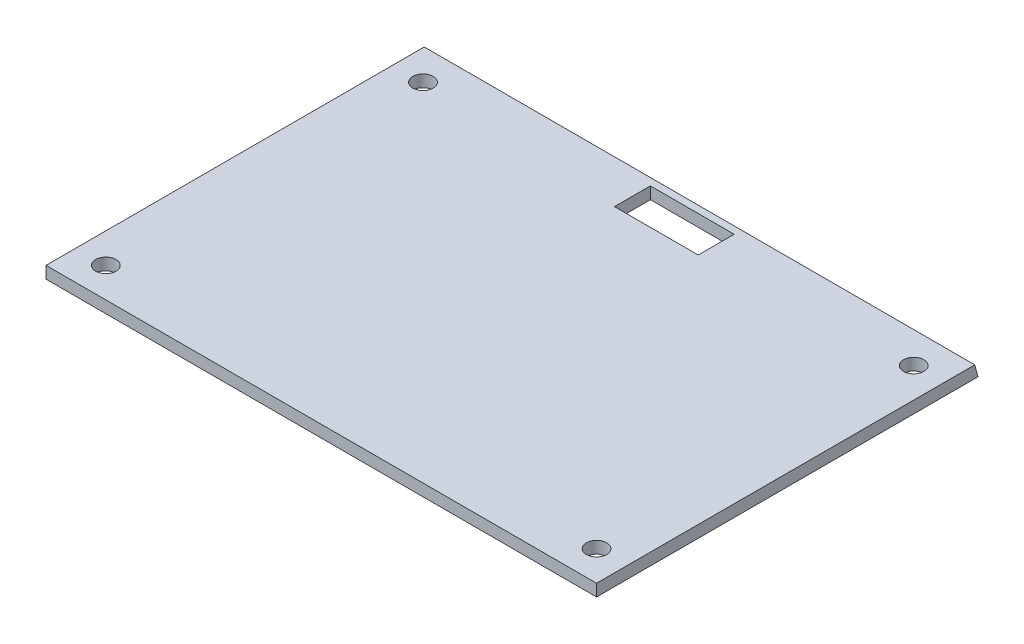
ISO-10303-21;
HEADER;
FILE_DESCRIPTION(('STEP AP214'),'2;1');
FILE_NAME('part.step','',(''),(''),'','','');
FILE_SCHEMA(('AUTOMOTIVE_DESIGN { 1 0 10303 214 1 1 1 1 }'));
ENDSEC;
DATA;
#1=APPLICATION_CONTEXT('core data for automotive mechanical design processes');
#2=APPLICATION_PROTOCOL_DEFINITION('international standard','automotive_design',2000,#1);
#3=PRODUCT_CONTEXT('',#1,'mechanical');
#4=PRODUCT('Part','Part','',(#3));
#5=PRODUCT_RELATED_PRODUCT_CATEGORY('part','',(#4));
#6=PRODUCT_DEFINITION_FORMATION('','',#4);
#7=PRODUCT_DEFINITION_CONTEXT('part definition',#1,'design');
#8=PRODUCT_DEFINITION('design','',#6,#7);
#9=PRODUCT_DEFINITION_SHAPE('','',#8);
#10=(LENGTH_UNIT() NAMED_UNIT(*) SI_UNIT(.MILLI.,.METRE.));
#11=(NAMED_UNIT(*) PLANE_ANGLE_UNIT() SI_UNIT($,.RADIAN.));
#12=(NAMED_UNIT(*) SI_UNIT($,.STERADIAN.) SOLID_ANGLE_UNIT());
#13=UNCERTAINTY_MEASURE_WITH_UNIT(LENGTH_MEASURE(1.E-05),#10,'distance_accuracy_value','');
#14=(GEOMETRIC_REPRESENTATION_CONTEXT(3) GLOBAL_UNCERTAINTY_ASSIGNED_CONTEXT((#13)) GLOBAL_UNIT_ASSIGNED_CONTEXT((#10,
#11,#12)) REPRESENTATION_CONTEXT('',''));
#15=CARTESIAN_POINT('',(0.,0.,0.));
#16=DIRECTION('',(0.,0.,1.));
#17=DIRECTION('',(1.,0.,0.));
#18=AXIS2_PLACEMENT_3D('',#15,#16,#17);
#19=CARTESIAN_POINT('',(-46.,-46.,120.));
#20=DIRECTION('',(0.,1.,0.));
#21=DIRECTION('',(0.,0.,1.));
#22=AXIS2_PLACEMENT_3D('',#19,#20,#21);
#23=PLANE('',#22);
#24=CARTESIAN_POINT('',(41.,-46.,62.));
#25=DIRECTION('',(0.,1.,0.));
#26=DIRECTION('',(0.,0.,1.));
#27=AXIS2_PLACEMENT_3D('',#24,#25,#26);
#28=CIRCLE('',#27,1.7);
#29=CARTESIAN_POINT('',(41.,-46.,63.7));
#30=VERTEX_POINT('',#29);
#31=EDGE_CURVE('E158',#30,#30,#28,.F.);
#32=ORIENTED_EDGE('',*,*,#31,.F.);
#33=EDGE_LOOP('',(#32));
#34=FACE_BOUND('',#33,.T.);
#35=CARTESIAN_POINT('',(-41.,-46.,115.));
#36=DIRECTION('',(0.,1.,0.));
#37=DIRECTION('',(0.,0.,1.));
#38=AXIS2_PLACEMENT_3D('',#35,#36,#37);
#39=CIRCLE('',#38,1.7);
#40=CARTESIAN_POINT('',(-41.,-46.,116.7));
#41=VERTEX_POINT('',#40);
#42=EDGE_CURVE('E147',#41,#41,#39,.F.);
#43=ORIENTED_EDGE('',*,*,#42,.F.);
#44=EDGE_LOOP('',(#43));
#45=FACE_BOUND('',#44,.T.);
#46=CARTESIAN_POINT('',(41.,-46.,115.));
#47=DIRECTION('',(0.,1.,0.));
#48=DIRECTION('',(0.,0.,1.));
#49=AXIS2_PLACEMENT_3D('',#46,#47,#48);
#50=CIRCLE('',#49,1.7);
#51=CARTESIAN_POINT('',(41.,-46.,116.7));
#52=VERTEX_POINT('',#51);
#53=EDGE_CURVE('E144',#52,#52,#50,.F.);
#54=ORIENTED_EDGE('',*,*,#53,.F.);
#55=EDGE_LOOP('',(#54));
#56=FACE_BOUND('',#55,.T.);
#57=CARTESIAN_POINT('',(-41.,-46.,62.));
#58=DIRECTION('',(0.,1.,0.));
#59=DIRECTION('',(0.,0.,1.));
#60=AXIS2_PLACEMENT_3D('',#57,#58,#59);
#61=CIRCLE('',#60,1.7);
#62=CARTESIAN_POINT('',(-41.,-46.,63.7));
#63=VERTEX_POINT('',#62);
#64=EDGE_CURVE('E141',#63,#63,#61,.F.);
#65=ORIENTED_EDGE('',*,*,#64,.F.);
#66=EDGE_LOOP('',(#65));
#67=FACE_BOUND('',#66,.T.);
#68=DIRECTION('',(0.,0.,-1.));
#69=VECTOR('',#68,1.);
#70=CARTESIAN_POINT('',(-7.,-46.,120.));
#71=LINE('',#70,#69);
#72=CARTESIAN_POINT('',(-7.,-46.,64.));
#73=VERTEX_POINT('',#72);
#74=CARTESIAN_POINT('',(-7.,-46.,58.));
#75=VERTEX_POINT('',#74);
#76=EDGE_CURVE('E179',#73,#75,#71,.T.);
#77=ORIENTED_EDGE('',*,*,#76,.F.);
#78=DIRECTION('',(-1.,0.,0.));
#79=VECTOR('',#78,1.);
#80=CARTESIAN_POINT('',(-46.,-46.,64.));
#81=LINE('',#80,#79);
#82=CARTESIAN_POINT('',(7.,-46.,64.));
#83=VERTEX_POINT('',#82);
#84=EDGE_CURVE('E177',#83,#73,#81,.T.);
#85=ORIENTED_EDGE('',*,*,#84,.F.);
#86=DIRECTION('',(0.,0.,1.));
#87=VECTOR('',#86,1.);
#88=CARTESIAN_POINT('',(7.,-46.,120.));
#89=LINE('',#88,#87);
#90=CARTESIAN_POINT('',(7.,-46.,58.));
#91=VERTEX_POINT('',#90);
#92=EDGE_CURVE('E175',#91,#83,#89,.T.);
#93=ORIENTED_EDGE('',*,*,#92,.F.);
#94=DIRECTION('',(1.,0.,0.));
#95=VECTOR('',#94,1.);
#96=CARTESIAN_POINT('',(-46.,-46.,58.));
#97=LINE('',#96,#95);
#98=EDGE_CURVE('E173',#75,#91,#97,.T.);
#99=ORIENTED_EDGE('',*,*,#98,.F.);
#100=EDGE_LOOP('',(#77,#85,#93,#99));
#101=FACE_BOUND('',#100,.T.);
#102=DIRECTION('',(-1.,0.,0.));
#103=VECTOR('',#102,1.);
#104=CARTESIAN_POINT('',(-46.,-46.,56.253589617225));
#105=LINE('',#104,#103);
#106=CARTESIAN_POINT('',(46.,-46.,56.253589617225));
#107=VERTEX_POINT('',#106);
#108=CARTESIAN_POINT('',(-46.,-46.,56.253589617225));
#109=VERTEX_POINT('',#108);
#110=EDGE_CURVE('E106',#107,#109,#105,.T.);
#111=ORIENTED_EDGE('',*,*,#110,.F.);
#112=DIRECTION('',(0.,0.,-1.));
#113=VECTOR('',#112,1.);
#114=CARTESIAN_POINT('',(46.,-46.,120.));
#115=LINE('',#114,#113);
#116=CARTESIAN_POINT('',(46.,-46.,120.));
#117=VERTEX_POINT('',#116);
#118=EDGE_CURVE('E115',#117,#107,#115,.T.);
#119=ORIENTED_EDGE('',*,*,#118,.F.);
#120=DIRECTION('',(1.,0.,0.));
#121=VECTOR('',#120,1.);
#122=CARTESIAN_POINT('',(-46.,-46.,120.));
#123=LINE('',#122,#121);
#124=CARTESIAN_POINT('',(-46.,-46.,120.));
#125=VERTEX_POINT('',#124);
#126=EDGE_CURVE('E184',#125,#117,#123,.T.);
#127=ORIENTED_EDGE('',*,*,#126,.F.);
#128=DIRECTION('',(0.,0.,-1.));
#129=VECTOR('',#128,1.);
#130=CARTESIAN_POINT('',(-46.,-46.,120.));
#131=LINE('',#130,#129);
#132=EDGE_CURVE('E118',#125,#109,#131,.T.);
#133=ORIENTED_EDGE('',*,*,#132,.T.);
#134=EDGE_LOOP('',(#111,#119,#127,#133));
#135=FACE_BOUND('',#134,.T.);
#136=ADVANCED_FACE('F41',(#34,#45,#56,#67,#101,#135),#23,.F.);
#137=CARTESIAN_POINT('',(-46.,-44.,120.));
#138=DIRECTION('',(0.,-1.,0.));
#139=DIRECTION('',(0.,0.,-1.));
#140=AXIS2_PLACEMENT_3D('',#137,#138,#139);
#141=PLANE('',#140);
#142=CARTESIAN_POINT('',(41.,-44.,62.));
#143=DIRECTION('',(0.,-1.,0.));
#144=DIRECTION('',(0.,0.,-1.));
#145=AXIS2_PLACEMENT_3D('',#142,#143,#144);
#146=CIRCLE('',#145,1.7);
#147=CARTESIAN_POINT('',(41.,-44.,60.3));
#148=VERTEX_POINT('',#147);
#149=EDGE_CURVE('E45',#148,#148,#146,.F.);
#150=ORIENTED_EDGE('',*,*,#149,.F.);
#151=EDGE_LOOP('',(#150));
#152=FACE_BOUND('',#151,.T.);
#153=CARTESIAN_POINT('',(-41.,-44.,115.));
#154=DIRECTION('',(0.,-1.,0.));
#155=DIRECTION('',(0.,0.,-1.));
#156=AXIS2_PLACEMENT_3D('',#153,#154,#155);
#157=CIRCLE('',#156,1.7);
#158=CARTESIAN_POINT('',(-41.,-44.,113.3));
#159=VERTEX_POINT('',#158);
#160=EDGE_CURVE('E145',#159,#159,#157,.F.);
#161=ORIENTED_EDGE('',*,*,#160,.F.);
#162=EDGE_LOOP('',(#161));
#163=FACE_BOUND('',#162,.T.);
#164=CARTESIAN_POINT('',(41.,-44.,115.));
#165=DIRECTION('',(0.,-1.,0.));
#166=DIRECTION('',(0.,0.,-1.));
#167=AXIS2_PLACEMENT_3D('',#164,#165,#166);
#168=CIRCLE('',#167,1.7);
#169=CARTESIAN_POINT('',(41.,-44.,113.3));
#170=VERTEX_POINT('',#169);
#171=EDGE_CURVE('E142',#170,#170,#168,.F.);
#172=ORIENTED_EDGE('',*,*,#171,.F.);
#173=EDGE_LOOP('',(#172));
#174=FACE_BOUND('',#173,.T.);
#175=CARTESIAN_POINT('',(-41.,-44.,62.));
#176=DIRECTION('',(0.,-1.,0.));
#177=DIRECTION('',(0.,0.,-1.));
#178=AXIS2_PLACEMENT_3D('',#175,#176,#177);
#179=CIRCLE('',#178,1.7);
#180=CARTESIAN_POINT('',(-41.,-44.,60.3));
#181=VERTEX_POINT('',#180);
#182=EDGE_CURVE('E138',#181,#181,#179,.F.);
#183=ORIENTED_EDGE('',*,*,#182,.F.);
#184=EDGE_LOOP('',(#183));
#185=FACE_BOUND('',#184,.T.);
#186=DIRECTION('',(0.,0.,1.));
#187=VECTOR('',#186,1.);
#188=CARTESIAN_POINT('',(-7.,-44.,120.));
#189=LINE('',#188,#187);
#190=CARTESIAN_POINT('',(-7.,-44.,58.));
#191=VERTEX_POINT('',#190);
#192=CARTESIAN_POINT('',(-7.,-44.,64.));
#193=VERTEX_POINT('',#192);
#194=EDGE_CURVE('E50',#191,#193,#189,.T.);
#195=ORIENTED_EDGE('',*,*,#194,.F.);
#196=DIRECTION('',(-1.,0.,0.));
#197=VECTOR('',#196,1.);
#198=CARTESIAN_POINT('',(-46.,-44.,58.));
#199=LINE('',#198,#197);
#200=CARTESIAN_POINT('',(7.,-44.,58.));
#201=VERTEX_POINT('',#200);
#202=EDGE_CURVE('E125',#201,#191,#199,.T.);
#203=ORIENTED_EDGE('',*,*,#202,.F.);
#204=DIRECTION('',(0.,0.,-1.));
#205=VECTOR('',#204,1.);
#206=CARTESIAN_POINT('',(7.,-44.,120.));
#207=LINE('',#206,#205);
#208=CARTESIAN_POINT('',(7.,-44.,64.));
#209=VERTEX_POINT('',#208);
#210=EDGE_CURVE('E132',#209,#201,#207,.T.);
#211=ORIENTED_EDGE('',*,*,#210,.F.);
#212=DIRECTION('',(1.,0.,0.));
#213=VECTOR('',#212,1.);
#214=CARTESIAN_POINT('',(-46.,-44.,64.));
#215=LINE('',#214,#213);
#216=EDGE_CURVE('E135',#193,#209,#215,.T.);
#217=ORIENTED_EDGE('',*,*,#216,.F.);
#218=EDGE_LOOP('',(#195,#203,#211,#217));
#219=FACE_BOUND('',#218,.T.);
#220=DIRECTION('',(1.,0.,0.));
#221=VECTOR('',#220,1.);
#222=CARTESIAN_POINT('',(-46.,-44.,56.7894880020872));
#223=LINE('',#222,#221);
#224=CARTESIAN_POINT('',(-46.,-44.,56.7894880020872));
#225=VERTEX_POINT('',#224);
#226=CARTESIAN_POINT('',(46.,-44.,56.7894880020872));
#227=VERTEX_POINT('',#226);
#228=EDGE_CURVE('E57',#225,#227,#223,.T.);
#229=ORIENTED_EDGE('',*,*,#228,.F.);
#230=DIRECTION('',(0.,0.,-1.));
#231=VECTOR('',#230,1.);
#232=CARTESIAN_POINT('',(-46.,-44.,120.));
#233=LINE('',#232,#231);
#234=CARTESIAN_POINT('',(-46.,-44.,120.));
#235=VERTEX_POINT('',#234);
#236=EDGE_CURVE('E127',#235,#225,#233,.T.);
#237=ORIENTED_EDGE('',*,*,#236,.F.);
#238=DIRECTION('',(-1.,0.,0.));
#239=VECTOR('',#238,1.);
#240=CARTESIAN_POINT('',(-46.,-44.,120.));
#241=LINE('',#240,#239);
#242=CARTESIAN_POINT('',(46.,-44.,120.));
#243=VERTEX_POINT('',#242);
#244=EDGE_CURVE('E187',#243,#235,#241,.T.);
#245=ORIENTED_EDGE('',*,*,#244,.F.);
#246=DIRECTION('',(0.,0.,-1.));
#247=VECTOR('',#246,1.);
#248=CARTESIAN_POINT('',(46.,-44.,120.));
#249=LINE('',#248,#247);
#250=EDGE_CURVE('E123',#243,#227,#249,.T.);
#251=ORIENTED_EDGE('',*,*,#250,.T.);
#252=EDGE_LOOP('',(#229,#237,#245,#251));
#253=FACE_BOUND('',#252,.T.);
#254=ADVANCED_FACE('F194',(#152,#163,#174,#185,#219,#253),#141,.F.);
#255=CARTESIAN_POINT('',(-46.,-46.,120.));
#256=DIRECTION('',(1.,0.,0.));
#257=DIRECTION('',(0.,0.,-1.));
#258=AXIS2_PLACEMENT_3D('',#255,#256,#257);
#259=PLANE('',#258);
#260=DIRECTION('',(0.,0.965925826289068,0.258819045102521));
#261=VECTOR('',#260,1.);
#262=CARTESIAN_POINT('',(-46.,-30.0633974043062,60.5237894128368));
#263=LINE('',#262,#261);
#264=EDGE_CURVE('E119',#109,#225,#263,.T.);
#265=ORIENTED_EDGE('',*,*,#264,.F.);
#266=ORIENTED_EDGE('',*,*,#132,.F.);
#267=DIRECTION('',(0.,-1.,0.));
#268=VECTOR('',#267,1.);
#269=CARTESIAN_POINT('',(-46.,-46.,120.));
#270=LINE('',#269,#268);
#271=EDGE_CURVE('E181',#235,#125,#270,.T.);
#272=ORIENTED_EDGE('',*,*,#271,.F.);
#273=ORIENTED_EDGE('',*,*,#236,.T.);
#274=EDGE_LOOP('',(#265,#266,#272,#273));
#275=FACE_BOUND('',#274,.T.);
#276=ADVANCED_FACE('F43',(#275),#259,.F.);
#277=CARTESIAN_POINT('',(46.,-46.,120.));
#278=DIRECTION('',(-1.,0.,0.));
#279=DIRECTION('',(0.,0.,1.));
#280=AXIS2_PLACEMENT_3D('',#277,#278,#279);
#281=PLANE('',#280);
#282=DIRECTION('',(0.,-0.965925826289068,-0.258819045102521));
#283=VECTOR('',#282,1.);
#284=CARTESIAN_POINT('',(46.,-30.0633974043062,60.5237894128368));
#285=LINE('',#284,#283);
#286=EDGE_CURVE('E11',#227,#107,#285,.T.);
#287=ORIENTED_EDGE('',*,*,#286,.F.);
#288=ORIENTED_EDGE('',*,*,#250,.F.);
#289=DIRECTION('',(0.,1.,0.));
#290=VECTOR('',#289,1.);
#291=CARTESIAN_POINT('',(46.,-46.,120.));
#292=LINE('',#291,#290);
#293=EDGE_CURVE('E122',#117,#243,#292,.T.);
#294=ORIENTED_EDGE('',*,*,#293,.F.);
#295=ORIENTED_EDGE('',*,*,#118,.T.);
#296=EDGE_LOOP('',(#287,#288,#294,#295));
#297=FACE_BOUND('',#296,.T.);
#298=ADVANCED_FACE('F121',(#297),#281,.F.);
#299=CARTESIAN_POINT('',(0.,0.,120.));
#300=DIRECTION('',(0.,0.,-1.));
#301=DIRECTION('',(-1.,0.,0.));
#302=AXIS2_PLACEMENT_3D('',#299,#300,#301);
#303=PLANE('',#302);
#304=ORIENTED_EDGE('',*,*,#271,.T.);
#305=ORIENTED_EDGE('',*,*,#126,.T.);
#306=ORIENTED_EDGE('',*,*,#293,.T.);
#307=ORIENTED_EDGE('',*,*,#244,.T.);
#308=EDGE_LOOP('',(#304,#305,#306,#307));
#309=FACE_BOUND('',#308,.T.);
#310=ADVANCED_FACE('F196',(#309),#303,.F.);
#311=CARTESIAN_POINT('',(-7.,-43.,58.));
#312=DIRECTION('',(1.,0.,0.));
#313=DIRECTION('',(0.,0.,-1.));
#314=AXIS2_PLACEMENT_3D('',#311,#312,#313);
#315=PLANE('',#314);
#316=ORIENTED_EDGE('',*,*,#76,.T.);
#317=DIRECTION('',(0.,-1.,0.));
#318=VECTOR('',#317,1.);
#319=CARTESIAN_POINT('',(-7.,-43.,58.));
#320=LINE('',#319,#318);
#321=EDGE_CURVE('E65',#191,#75,#320,.T.);
#322=ORIENTED_EDGE('',*,*,#321,.F.);
#323=ORIENTED_EDGE('',*,*,#194,.T.);
#324=DIRECTION('',(0.,-1.,0.));
#325=VECTOR('',#324,1.);
#326=CARTESIAN_POINT('',(-7.,-43.,64.));
#327=LINE('',#326,#325);
#328=EDGE_CURVE('E170',#193,#73,#327,.T.);
#329=ORIENTED_EDGE('',*,*,#328,.T.);
#330=EDGE_LOOP('',(#316,#322,#323,#329));
#331=FACE_BOUND('',#330,.T.);
#332=ADVANCED_FACE('F198',(#331),#315,.T.);
#333=CARTESIAN_POINT('',(-7.,-43.,64.));
#334=DIRECTION('',(0.,0.,-1.));
#335=DIRECTION('',(-1.,0.,0.));
#336=AXIS2_PLACEMENT_3D('',#333,#334,#335);
#337=PLANE('',#336);
#338=ORIENTED_EDGE('',*,*,#84,.T.);
#339=ORIENTED_EDGE('',*,*,#328,.F.);
#340=ORIENTED_EDGE('',*,*,#216,.T.);
#341=DIRECTION('',(0.,-1.,0.));
#342=VECTOR('',#341,1.);
#343=CARTESIAN_POINT('',(7.,-43.,64.));
#344=LINE('',#343,#342);
#345=EDGE_CURVE('E167',#209,#83,#344,.T.);
#346=ORIENTED_EDGE('',*,*,#345,.T.);
#347=EDGE_LOOP('',(#338,#339,#340,#346));
#348=FACE_BOUND('',#347,.T.);
#349=ADVANCED_FACE('F203',(#348),#337,.T.);
#350=CARTESIAN_POINT('',(7.,-43.,58.));
#351=DIRECTION('',(-1.,0.,0.));
#352=DIRECTION('',(0.,0.,1.));
#353=AXIS2_PLACEMENT_3D('',#350,#351,#352);
#354=PLANE('',#353);
#355=ORIENTED_EDGE('',*,*,#92,.T.);
#356=ORIENTED_EDGE('',*,*,#345,.F.);
#357=ORIENTED_EDGE('',*,*,#210,.T.);
#358=DIRECTION('',(0.,-1.,0.));
#359=VECTOR('',#358,1.);
#360=CARTESIAN_POINT('',(7.,-43.,58.));
#361=LINE('',#360,#359);
#362=EDGE_CURVE('E164',#201,#91,#361,.T.);
#363=ORIENTED_EDGE('',*,*,#362,.T.);
#364=EDGE_LOOP('',(#355,#356,#357,#363));
#365=FACE_BOUND('',#364,.T.);
#366=ADVANCED_FACE('F237',(#365),#354,.T.);
#367=CARTESIAN_POINT('',(-7.,-43.,58.));
#368=DIRECTION('',(0.,0.,1.));
#369=DIRECTION('',(1.,0.,0.));
#370=AXIS2_PLACEMENT_3D('',#367,#368,#369);
#371=PLANE('',#370);
#372=ORIENTED_EDGE('',*,*,#98,.T.);
#373=ORIENTED_EDGE('',*,*,#362,.F.);
#374=ORIENTED_EDGE('',*,*,#202,.T.);
#375=ORIENTED_EDGE('',*,*,#321,.T.);
#376=EDGE_LOOP('',(#372,#373,#374,#375));
#377=FACE_BOUND('',#376,.T.);
#378=ADVANCED_FACE('F238',(#377),#371,.T.);
#379=CARTESIAN_POINT('',(47.,-40.,57.8612847718117));
#380=DIRECTION('',(0.,0.258819045102521,-0.965925826289068));
#381=DIRECTION('',(0.,0.965925826289068,0.258819045102521));
#382=AXIS2_PLACEMENT_3D('',#379,#380,#381);
#383=PLANE('',#382);
#384=ORIENTED_EDGE('',*,*,#264,.T.);
#385=ORIENTED_EDGE('',*,*,#228,.T.);
#386=ORIENTED_EDGE('',*,*,#286,.T.);
#387=ORIENTED_EDGE('',*,*,#110,.T.);
#388=EDGE_LOOP('',(#384,#385,#386,#387));
#389=FACE_BOUND('',#388,.T.);
#390=ADVANCED_FACE('F105',(#389),#383,.T.);
#391=CARTESIAN_POINT('',(-41.,-43.,62.));
#392=DIRECTION('',(0.,-1.,0.));
#393=DIRECTION('',(0.,0.,-1.));
#394=AXIS2_PLACEMENT_3D('',#391,#392,#393);
#395=CYLINDRICAL_SURFACE('',#394,1.7);
#396=ORIENTED_EDGE('',*,*,#182,.T.);
#397=EDGE_LOOP('',(#396));
#398=FACE_BOUND('',#397,.T.);
#399=ORIENTED_EDGE('',*,*,#64,.T.);
#400=EDGE_LOOP('',(#399));
#401=FACE_BOUND('',#400,.T.);
#402=ADVANCED_FACE('F245',(#398,#401),#395,.F.);
#403=CARTESIAN_POINT('',(41.,-43.,115.));
#404=DIRECTION('',(0.,-1.,0.));
#405=DIRECTION('',(0.,0.,-1.));
#406=AXIS2_PLACEMENT_3D('',#403,#404,#405);
#407=CYLINDRICAL_SURFACE('',#406,1.7);
#408=ORIENTED_EDGE('',*,*,#171,.T.);
#409=EDGE_LOOP('',(#408));
#410=FACE_BOUND('',#409,.T.);
#411=ORIENTED_EDGE('',*,*,#53,.T.);
#412=EDGE_LOOP('',(#411));
#413=FACE_BOUND('',#412,.T.);
#414=ADVANCED_FACE('F300',(#410,#413),#407,.F.);
#415=CARTESIAN_POINT('',(-41.,-43.,115.));
#416=DIRECTION('',(0.,-1.,0.));
#417=DIRECTION('',(0.,0.,-1.));
#418=AXIS2_PLACEMENT_3D('',#415,#416,#417);
#419=CYLINDRICAL_SURFACE('',#418,1.7);
#420=ORIENTED_EDGE('',*,*,#160,.T.);
#421=EDGE_LOOP('',(#420));
#422=FACE_BOUND('',#421,.T.);
#423=ORIENTED_EDGE('',*,*,#42,.T.);
#424=EDGE_LOOP('',(#423));
#425=FACE_BOUND('',#424,.T.);
#426=ADVANCED_FACE('F309',(#422,#425),#419,.F.);
#427=CARTESIAN_POINT('',(41.,-43.,62.));
#428=DIRECTION('',(0.,-1.,0.));
#429=DIRECTION('',(0.,0.,-1.));
#430=AXIS2_PLACEMENT_3D('',#427,#428,#429);
#431=CYLINDRICAL_SURFACE('',#430,1.7);
#432=ORIENTED_EDGE('',*,*,#149,.T.);
#433=EDGE_LOOP('',(#432));
#434=FACE_BOUND('',#433,.T.);
#435=ORIENTED_EDGE('',*,*,#31,.T.);
#436=EDGE_LOOP('',(#435));
#437=FACE_BOUND('',#436,.T.);
#438=ADVANCED_FACE('F319',(#434,#437),#431,.F.);
#439=CLOSED_SHELL('',(#136,#254,#276,#298,#310,#332,#349,#366,#378,#390,#402,#414,#426,#438));
#440=MANIFOLD_SOLID_BREP('B2',#439);
#441=ADVANCED_BREP_SHAPE_REPRESENTATION('',(#18,#440),#14);
#442=SHAPE_DEFINITION_REPRESENTATION(#9,#441);
ENDSEC;
END-ISO-10303-21;
